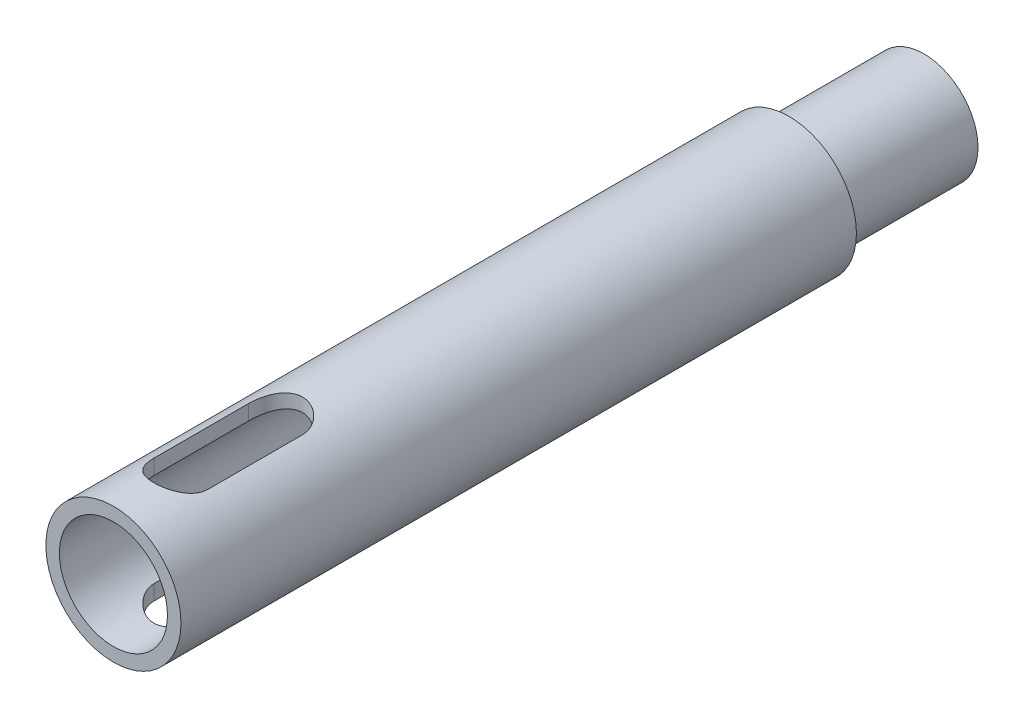
ISO-10303-21;
HEADER;
FILE_DESCRIPTION(('STEP AP214'),'2;1');
FILE_NAME('part.step','',(''),(''),'','','');
FILE_SCHEMA(('AUTOMOTIVE_DESIGN { 1 0 10303 214 1 1 1 1 }'));
ENDSEC;
DATA;
#1=APPLICATION_CONTEXT('core data for automotive mechanical design processes');
#2=APPLICATION_PROTOCOL_DEFINITION('international standard','automotive_design',2000,#1);
#3=PRODUCT_CONTEXT('',#1,'mechanical');
#4=PRODUCT('Part','Part','',(#3));
#5=PRODUCT_RELATED_PRODUCT_CATEGORY('part','',(#4));
#6=PRODUCT_DEFINITION_FORMATION('','',#4);
#7=PRODUCT_DEFINITION_CONTEXT('part definition',#1,'design');
#8=PRODUCT_DEFINITION('design','',#6,#7);
#9=PRODUCT_DEFINITION_SHAPE('','',#8);
#10=(LENGTH_UNIT() NAMED_UNIT(*) SI_UNIT(.MILLI.,.METRE.));
#11=(NAMED_UNIT(*) PLANE_ANGLE_UNIT() SI_UNIT($,.RADIAN.));
#12=(NAMED_UNIT(*) SI_UNIT($,.STERADIAN.) SOLID_ANGLE_UNIT());
#13=UNCERTAINTY_MEASURE_WITH_UNIT(LENGTH_MEASURE(1.E-05),#10,'distance_accuracy_value','');
#14=(GEOMETRIC_REPRESENTATION_CONTEXT(3) GLOBAL_UNCERTAINTY_ASSIGNED_CONTEXT((#13)) GLOBAL_UNIT_ASSIGNED_CONTEXT((#10,
#11,#12)) REPRESENTATION_CONTEXT('',''));
#15=CARTESIAN_POINT('',(0.,0.,0.));
#16=DIRECTION('',(0.,0.,1.));
#17=DIRECTION('',(1.,0.,0.));
#18=AXIS2_PLACEMENT_3D('',#15,#16,#17);
#19=CARTESIAN_POINT('',(0.,0.,60.));
#20=DIRECTION('',(0.,0.,-1.));
#21=DIRECTION('',(-1.,0.,0.));
#22=AXIS2_PLACEMENT_3D('',#19,#20,#21);
#23=CYLINDRICAL_SURFACE('',#22,5.);
#24=DIRECTION('',(0.,0.,-1.));
#25=VECTOR('',#24,1.);
#26=CARTESIAN_POINT('',(-2.,-4.58257569495584,60.));
#27=LINE('',#26,#25);
#28=CARTESIAN_POINT('',(-2.,-4.58257569495584,48.));
#29=VERTEX_POINT('',#28);
#30=CARTESIAN_POINT('',(-2.,-4.58257569495584,55.));
#31=VERTEX_POINT('',#30);
#32=EDGE_CURVE('E235',#29,#31,#27,.F.);
#33=ORIENTED_EDGE('',*,*,#32,.T.);
#34=CARTESIAN_POINT('',(-2.,-4.58257569495584,55.));
#35=CARTESIAN_POINT('',(-2.00000798036347,-4.58256464470381,55.0538058525026));
#36=CARTESIAN_POINT('',(-1.99782891366025,-4.58352306077323,55.1076056655576));
#37=CARTESIAN_POINT('',(-1.98915905973446,-4.58729625417543,55.2147712982547));
#38=CARTESIAN_POINT('',(-1.98266991468792,-4.59011032448545,55.268137275356));
#39=CARTESIAN_POINT('',(-1.9654760367637,-4.59749782920639,55.3738468215588));
#40=CARTESIAN_POINT('',(-1.95478796820434,-4.60206430717533,55.426193584044));
#41=CARTESIAN_POINT('',(-1.9293163019066,-4.61280053296682,55.5297007717145));
#42=CARTESIAN_POINT('',(-1.9145324541709,-4.61897037865398,55.5808611242772));
#43=CARTESIAN_POINT('',(-1.86426971793523,-4.63959291248421,55.731935850582));
#44=CARTESIAN_POINT('',(-1.82284489460008,-4.6561744915743,55.8296542306897));
#45=CARTESIAN_POINT('',(-1.72548191592177,-4.6931237076538,56.0167955800826));
#46=CARTESIAN_POINT('',(-1.66952996336926,-4.71349493864007,56.1062105529616));
#47=CARTESIAN_POINT('',(-1.54131835736855,-4.75700999402114,56.2792623966742));
#48=CARTESIAN_POINT('',(-1.4683691399273,-4.78024245635516,56.3623672169202));
#49=CARTESIAN_POINT('',(-1.30969646176209,-4.82612790548656,56.5155402722107));
#50=CARTESIAN_POINT('',(-1.22397038499682,-4.84878077249721,56.5856058308657));
#51=CARTESIAN_POINT('',(-1.03800590808969,-4.89203417106082,56.7134063941956));
#52=CARTESIAN_POINT('',(-0.937327933050969,-4.91251824543531,56.7705448092619));
#53=CARTESIAN_POINT('',(-0.726824143246717,-4.94803944125004,56.8668440726886));
#54=CARTESIAN_POINT('',(-0.617002169026251,-4.96307883544185,56.9060124240517));
#55=CARTESIAN_POINT('',(-0.396967441295696,-4.98538314653816,56.9633412013106));
#56=CARTESIAN_POINT('',(-0.287031054523065,-4.99298922547927,56.9824269509057));
#57=CARTESIAN_POINT('',(-0.0652684304565214,-5.00080310201086,57.0020284799456));
#58=CARTESIAN_POINT('',(0.0465571232841594,-5.0010135205303,57.0025508380235));
#59=CARTESIAN_POINT('',(0.262233376226779,-4.99421960045302,56.9855171608401));
#60=CARTESIAN_POINT('',(0.366179202506786,-4.98761985585461,56.968974953326));
#61=CARTESIAN_POINT('',(0.569674786500925,-4.96849270441446,56.9200065729465));
#62=CARTESIAN_POINT('',(0.669224295072838,-4.95596496209929,56.8875795011314));
#63=CARTESIAN_POINT('',(0.86289753907029,-4.92596830598785,56.8073637035755));
#64=CARTESIAN_POINT('',(0.956916851366435,-4.90842774755848,56.7593507591895));
#65=CARTESIAN_POINT('',(1.13580746919776,-4.87014602008043,56.6495354114049));
#66=CARTESIAN_POINT('',(1.22067554984697,-4.84940372896448,56.5877281703094));
#67=CARTESIAN_POINT('',(1.38476339273626,-4.80521782746144,56.4473558197415));
#68=CARTESIAN_POINT('',(1.46324770308939,-4.78168627172885,56.36795752533));
#69=CARTESIAN_POINT('',(1.60609926099477,-4.7356195058465,56.1970199048523));
#70=CARTESIAN_POINT('',(1.67046007709005,-4.71308475332783,56.1054750779057));
#71=CARTESIAN_POINT('',(1.78493657933605,-4.67095688856025,55.9095297159788));
#72=CARTESIAN_POINT('',(1.83458932217622,-4.65146702150583,55.8048351633398));
#73=CARTESIAN_POINT('',(1.91521298357264,-4.61886105059582,55.5876384755705));
#74=CARTESIAN_POINT('',(1.94621696002208,-4.60573367628738,55.4751505526617));
#75=CARTESIAN_POINT('',(1.9781058182572,-4.59208303529493,55.301256365842));
#76=CARTESIAN_POINT('',(1.98630505165979,-4.58853437680526,55.2413424506987));
#77=CARTESIAN_POINT('',(1.99725282103812,-4.58377540314389,55.1209649810045));
#78=CARTESIAN_POINT('',(2.00000471568568,-4.58256364711744,55.0605017882422));
#79=CARTESIAN_POINT('',(2.,-4.58257569495584,55.));
#80=B_SPLINE_CURVE_WITH_KNOTS('',3,(#34,#35,#36,#37,#38,#39,#40,#41,#42,#43,#44,#45,#46,#47,#48,
#49,#50,#51,#52,#53,#54,#55,#56,#57,#58,#59,#60,#61,#62,#63,#64,#65,#66,#67,#68,#69,#70,#71,#72,
#73,#74,#75,#76,#77,#78,#79),.UNSPECIFIED.,.F.,.F.,(4,2,2,2,2,2,2,2,2,2,2,2,2,2,2,2,2,2,2,2,2,2,
4),(0.,0.161354853098824,0.322648263883208,0.483307911251883,0.643977367092303,
0.964683001739086,1.28569434942625,1.62318047995498,1.9607358053919,2.31162858925763,
2.66237473197322,2.99613876504269,3.32978451514655,3.64468915259534,3.95961161305654,
4.27928176927546,4.59906421133018,4.93981874675152,5.28072813203933,5.63144241548461,
5.98153315592124,6.16300192557813,6.34435877193561),.UNSPECIFIED.);
#81=CARTESIAN_POINT('',(2.,-4.58257569495584,55.));
#82=VERTEX_POINT('',#81);
#83=EDGE_CURVE('E129',#31,#82,#80,.T.);
#84=ORIENTED_EDGE('',*,*,#83,.T.);
#85=DIRECTION('',(0.,0.,-1.));
#86=VECTOR('',#85,1.);
#87=CARTESIAN_POINT('',(2.,-4.58257569495584,60.));
#88=LINE('',#87,#86);
#89=CARTESIAN_POINT('',(2.,-4.58257569495584,48.));
#90=VERTEX_POINT('',#89);
#91=EDGE_CURVE('E188',#82,#90,#88,.T.);
#92=ORIENTED_EDGE('',*,*,#91,.T.);
#93=CARTESIAN_POINT('',(2.,-4.58257569495584,48.));
#94=CARTESIAN_POINT('',(2.00000798036348,-4.58256464470381,47.9461941474974));
#95=CARTESIAN_POINT('',(1.99782891366025,-4.58352306077323,47.8923943344423));
#96=CARTESIAN_POINT('',(1.98915905973447,-4.58729625417543,47.7852287017453));
#97=CARTESIAN_POINT('',(1.98266991468793,-4.59011032448545,47.731862724644));
#98=CARTESIAN_POINT('',(1.9654760367637,-4.59749782920639,47.6261531784412));
#99=CARTESIAN_POINT('',(1.95478796820434,-4.60206430717533,47.573806415956));
#100=CARTESIAN_POINT('',(1.92931630190661,-4.61280053296682,47.4702992282855));
#101=CARTESIAN_POINT('',(1.91453245417091,-4.61897037865398,47.4191388757228));
#102=CARTESIAN_POINT('',(1.86426971793523,-4.63959291248421,47.268064149418));
#103=CARTESIAN_POINT('',(1.82284489460008,-4.6561744915743,47.1703457693103));
#104=CARTESIAN_POINT('',(1.72548191592176,-4.6931237076538,46.9832044199174));
#105=CARTESIAN_POINT('',(1.66952996336926,-4.71349493864007,46.8937894470383));
#106=CARTESIAN_POINT('',(1.54131835736855,-4.75700999402114,46.7207376033258));
#107=CARTESIAN_POINT('',(1.4683691399273,-4.78024245635516,46.6376327830798));
#108=CARTESIAN_POINT('',(1.30969646176209,-4.82612790548656,46.4844597277893));
#109=CARTESIAN_POINT('',(1.22397038499682,-4.84878077249721,46.4143941691343));
#110=CARTESIAN_POINT('',(1.03800590808969,-4.89203417106082,46.2865936058043));
#111=CARTESIAN_POINT('',(0.937327933050962,-4.91251824543531,46.2294551907381));
#112=CARTESIAN_POINT('',(0.726824143246709,-4.94803944125004,46.1331559273114));
#113=CARTESIAN_POINT('',(0.617002169026242,-4.96307883544185,46.0939875759483));
#114=CARTESIAN_POINT('',(0.396967441295688,-4.98538314653816,46.0366587986894));
#115=CARTESIAN_POINT('',(0.287031054523057,-4.99298922547927,46.0175730490943));
#116=CARTESIAN_POINT('',(0.065268430456513,-5.00080310201086,45.9979715200544));
#117=CARTESIAN_POINT('',(-0.0465571232841676,-5.0010135205303,45.9974491619765));
#118=CARTESIAN_POINT('',(-0.262233376226786,-4.99421960045302,46.0144828391599));
#119=CARTESIAN_POINT('',(-0.366179202506794,-4.98761985585461,46.031025046674));
#120=CARTESIAN_POINT('',(-0.569674786500933,-4.96849270441446,46.0799934270535));
#121=CARTESIAN_POINT('',(-0.669224295072845,-4.95596496209929,46.1124204988686));
#122=CARTESIAN_POINT('',(-0.862897539070298,-4.92596830598785,46.1926362964245));
#123=CARTESIAN_POINT('',(-0.956916851366443,-4.90842774755848,46.2406492408105));
#124=CARTESIAN_POINT('',(-1.13580746919777,-4.87014602008043,46.3504645885952));
#125=CARTESIAN_POINT('',(-1.22067554984698,-4.84940372896448,46.4122718296906));
#126=CARTESIAN_POINT('',(-1.38476339273627,-4.80521782746144,46.5526441802585));
#127=CARTESIAN_POINT('',(-1.4632477030894,-4.78168627172884,46.63204247467));
#128=CARTESIAN_POINT('',(-1.60609926099478,-4.7356195058465,46.8029800951477));
#129=CARTESIAN_POINT('',(-1.67046007709006,-4.71308475332783,46.8945249220943));
#130=CARTESIAN_POINT('',(-1.78493657933605,-4.67095688856024,47.0904702840212));
#131=CARTESIAN_POINT('',(-1.83458932217622,-4.65146702150583,47.1951648366602));
#132=CARTESIAN_POINT('',(-1.91521298357264,-4.61886105059581,47.4123615244295));
#133=CARTESIAN_POINT('',(-1.94621696002208,-4.60573367628738,47.5248494473383));
#134=CARTESIAN_POINT('',(-1.9781058182572,-4.59208303529493,47.698743634158));
#135=CARTESIAN_POINT('',(-1.98630505165979,-4.58853437680526,47.7586575493013));
#136=CARTESIAN_POINT('',(-1.99725282103812,-4.58377540314388,47.8790350189956));
#137=CARTESIAN_POINT('',(-2.00000471568568,-4.58256364711744,47.9394982117578));
#138=CARTESIAN_POINT('',(-2.,-4.58257569495584,48.));
#139=B_SPLINE_CURVE_WITH_KNOTS('',3,(#93,#94,#95,#96,#97,#98,#99,#100,#101,#102,#103,#104,#105,
#106,#107,#108,#109,#110,#111,#112,#113,#114,#115,#116,#117,#118,#119,#120,#121,#122,#123,#124,
#125,#126,#127,#128,#129,#130,#131,#132,#133,#134,#135,#136,#137,#138),.UNSPECIFIED.,.F.,.F.,(4,
2,2,2,2,2,2,2,2,2,2,2,2,2,2,2,2,2,2,2,2,2,4),(0.,0.161354853098831,0.322648263883215,
0.48330791125189,0.64397736709231,0.964683001739094,1.28569434942625,1.62318047995498,
1.96073580539191,2.31162858925764,2.66237473197323,2.9961387650427,3.32978451514656,
3.64468915259536,3.95961161305655,4.27928176927548,4.59906421133019,4.93981874675155,
5.28072813203934,5.63144241548463,5.98153315592125,6.16300192557814,6.34435877193562),.UNSPECIFIED.);
#140=EDGE_CURVE('E191',#90,#29,#139,.T.);
#141=ORIENTED_EDGE('',*,*,#140,.T.);
#142=EDGE_LOOP('',(#33,#84,#92,#141));
#143=FACE_BOUND('',#142,.T.);
#144=DIRECTION('',(0.,0.,-1.));
#145=VECTOR('',#144,1.);
#146=CARTESIAN_POINT('',(2.,4.58257569495584,60.));
#147=LINE('',#146,#145);
#148=CARTESIAN_POINT('',(2.,4.58257569495584,48.));
#149=VERTEX_POINT('',#148);
#150=CARTESIAN_POINT('',(2.,4.58257569495584,55.));
#151=VERTEX_POINT('',#150);
#152=EDGE_CURVE('E185',#149,#151,#147,.F.);
#153=ORIENTED_EDGE('',*,*,#152,.T.);
#154=CARTESIAN_POINT('',(2.,4.58257569495584,55.));
#155=CARTESIAN_POINT('',(2.00000798036347,4.58256464470381,55.0538058525026));
#156=CARTESIAN_POINT('',(1.99782891366025,4.58352306077323,55.1076056655576));
#157=CARTESIAN_POINT('',(1.98915905973446,4.58729625417543,55.2147712982547));
#158=CARTESIAN_POINT('',(1.98266991468792,4.59011032448545,55.268137275356));
#159=CARTESIAN_POINT('',(1.9654760367637,4.59749782920639,55.3738468215588));
#160=CARTESIAN_POINT('',(1.95478796820434,4.60206430717533,55.426193584044));
#161=CARTESIAN_POINT('',(1.9293163019066,4.61280053296682,55.5297007717145));
#162=CARTESIAN_POINT('',(1.9145324541709,4.61897037865398,55.5808611242772));
#163=CARTESIAN_POINT('',(1.86426971793523,4.63959291248421,55.731935850582));
#164=CARTESIAN_POINT('',(1.82284489460008,4.6561744915743,55.8296542306897));
#165=CARTESIAN_POINT('',(1.72548191592177,4.6931237076538,56.0167955800826));
#166=CARTESIAN_POINT('',(1.66952996336926,4.71349493864007,56.1062105529616));
#167=CARTESIAN_POINT('',(1.54131835736855,4.75700999402114,56.2792623966742));
#168=CARTESIAN_POINT('',(1.4683691399273,4.78024245635516,56.3623672169202));
#169=CARTESIAN_POINT('',(1.30969646176209,4.82612790548656,56.5155402722107));
#170=CARTESIAN_POINT('',(1.22397038499682,4.84878077249721,56.5856058308657));
#171=CARTESIAN_POINT('',(1.03800590808969,4.89203417106082,56.7134063941956));
#172=CARTESIAN_POINT('',(0.937327933050969,4.91251824543531,56.7705448092619));
#173=CARTESIAN_POINT('',(0.726824143246717,4.94803944125004,56.8668440726886));
#174=CARTESIAN_POINT('',(0.617002169026251,4.96307883544185,56.9060124240517));
#175=CARTESIAN_POINT('',(0.396967441295696,4.98538314653816,56.9633412013106));
#176=CARTESIAN_POINT('',(0.287031054523065,4.99298922547927,56.9824269509057));
#177=CARTESIAN_POINT('',(0.0652684304565214,5.00080310201086,57.0020284799456));
#178=CARTESIAN_POINT('',(-0.0465571232841594,5.0010135205303,57.0025508380235));
#179=CARTESIAN_POINT('',(-0.262233376226779,4.99421960045302,56.9855171608401));
#180=CARTESIAN_POINT('',(-0.366179202506786,4.98761985585461,56.968974953326));
#181=CARTESIAN_POINT('',(-0.569674786500925,4.96849270441446,56.9200065729465));
#182=CARTESIAN_POINT('',(-0.669224295072838,4.95596496209929,56.8875795011314));
#183=CARTESIAN_POINT('',(-0.86289753907029,4.92596830598785,56.8073637035755));
#184=CARTESIAN_POINT('',(-0.956916851366435,4.90842774755848,56.7593507591895));
#185=CARTESIAN_POINT('',(-1.13580746919776,4.87014602008043,56.6495354114049));
#186=CARTESIAN_POINT('',(-1.22067554984697,4.84940372896448,56.5877281703094));
#187=CARTESIAN_POINT('',(-1.38476339273626,4.80521782746144,56.4473558197415));
#188=CARTESIAN_POINT('',(-1.46324770308939,4.78168627172885,56.36795752533));
#189=CARTESIAN_POINT('',(-1.60609926099477,4.7356195058465,56.1970199048523));
#190=CARTESIAN_POINT('',(-1.67046007709005,4.71308475332783,56.1054750779057));
#191=CARTESIAN_POINT('',(-1.78493657933605,4.67095688856025,55.9095297159788));
#192=CARTESIAN_POINT('',(-1.83458932217622,4.65146702150583,55.8048351633398));
#193=CARTESIAN_POINT('',(-1.91521298357264,4.61886105059582,55.5876384755705));
#194=CARTESIAN_POINT('',(-1.94621696002208,4.60573367628738,55.4751505526617));
#195=CARTESIAN_POINT('',(-1.9781058182572,4.59208303529493,55.301256365842));
#196=CARTESIAN_POINT('',(-1.98630505165979,4.58853437680526,55.2413424506987));
#197=CARTESIAN_POINT('',(-1.99725282103812,4.58377540314389,55.1209649810045));
#198=CARTESIAN_POINT('',(-2.00000471568568,4.58256364711744,55.0605017882422));
#199=CARTESIAN_POINT('',(-2.,4.58257569495584,55.));
#200=B_SPLINE_CURVE_WITH_KNOTS('',3,(#154,#155,#156,#157,#158,#159,#160,#161,#162,#163,#164,
#165,#166,#167,#168,#169,#170,#171,#172,#173,#174,#175,#176,#177,#178,#179,#180,#181,#182,#183,
#184,#185,#186,#187,#188,#189,#190,#191,#192,#193,#194,#195,#196,#197,#198,#199),.UNSPECIFIED.,
.F.,.F.,(4,2,2,2,2,2,2,2,2,2,2,2,2,2,2,2,2,2,2,2,2,2,4),(0.,0.161354853098824,0.322648263883208,
0.483307911251883,0.643977367092303,0.964683001739086,1.28569434942625,1.62318047995498,
1.9607358053919,2.31162858925763,2.66237473197322,2.99613876504269,3.32978451514655,
3.64468915259534,3.95961161305654,4.27928176927546,4.59906421133018,4.93981874675152,
5.28072813203933,5.63144241548461,5.98153315592124,6.16300192557813,6.34435877193561),.UNSPECIFIED.);
#201=CARTESIAN_POINT('',(-2.,4.58257569495584,55.));
#202=VERTEX_POINT('',#201);
#203=EDGE_CURVE('E177',#151,#202,#200,.T.);
#204=ORIENTED_EDGE('',*,*,#203,.T.);
#205=DIRECTION('',(0.,0.,-1.));
#206=VECTOR('',#205,1.);
#207=CARTESIAN_POINT('',(-2.,4.58257569495584,60.));
#208=LINE('',#207,#206);
#209=CARTESIAN_POINT('',(-2.,4.58257569495584,48.));
#210=VERTEX_POINT('',#209);
#211=EDGE_CURVE('E178',#202,#210,#208,.T.);
#212=ORIENTED_EDGE('',*,*,#211,.T.);
#213=CARTESIAN_POINT('',(-2.,4.58257569495584,48.));
#214=CARTESIAN_POINT('',(-2.00000798036348,4.58256464470381,47.9461941474974));
#215=CARTESIAN_POINT('',(-1.99782891366025,4.58352306077323,47.8923943344423));
#216=CARTESIAN_POINT('',(-1.98915905973446,4.58729625417543,47.7852287017453));
#217=CARTESIAN_POINT('',(-1.98266991468792,4.59011032448545,47.731862724644));
#218=CARTESIAN_POINT('',(-1.9654760367637,4.5974978292064,47.6261531784412));
#219=CARTESIAN_POINT('',(-1.95478796820434,4.60206430717533,47.573806415956));
#220=CARTESIAN_POINT('',(-1.9293163019066,4.61280053296682,47.4702992282855));
#221=CARTESIAN_POINT('',(-1.9145324541709,4.61897037865398,47.4191388757228));
#222=CARTESIAN_POINT('',(-1.86426971793522,4.63959291248421,47.268064149418));
#223=CARTESIAN_POINT('',(-1.82284489460008,4.6561744915743,47.1703457693103));
#224=CARTESIAN_POINT('',(-1.72548191592176,4.6931237076538,46.9832044199174));
#225=CARTESIAN_POINT('',(-1.66952996336926,4.71349493864007,46.8937894470383));
#226=CARTESIAN_POINT('',(-1.54131835736855,4.75700999402114,46.7207376033258));
#227=CARTESIAN_POINT('',(-1.4683691399273,4.78024245635516,46.6376327830798));
#228=CARTESIAN_POINT('',(-1.30969646176209,4.82612790548656,46.4844597277893));
#229=CARTESIAN_POINT('',(-1.22397038499682,4.84878077249721,46.4143941691343));
#230=CARTESIAN_POINT('',(-1.03800590808968,4.89203417106082,46.2865936058043));
#231=CARTESIAN_POINT('',(-0.93732793305096,4.91251824543531,46.2294551907381));
#232=CARTESIAN_POINT('',(-0.726824143246708,4.94803944125004,46.1331559273114));
#233=CARTESIAN_POINT('',(-0.617002169026241,4.96307883544185,46.0939875759483));
#234=CARTESIAN_POINT('',(-0.396967441295686,4.98538314653816,46.0366587986894));
#235=CARTESIAN_POINT('',(-0.287031054523055,4.99298922547927,46.0175730490943));
#236=CARTESIAN_POINT('',(-0.0652684304565112,5.00080310201085,45.9979715200544));
#237=CARTESIAN_POINT('',(0.0465571232841692,5.0010135205303,45.9974491619765));
#238=CARTESIAN_POINT('',(0.262233376226788,4.99421960045302,46.0144828391599));
#239=CARTESIAN_POINT('',(0.366179202506796,4.98761985585461,46.031025046674));
#240=CARTESIAN_POINT('',(0.569674786500935,4.96849270441446,46.0799934270535));
#241=CARTESIAN_POINT('',(0.669224295072847,4.95596496209929,46.1124204988686));
#242=CARTESIAN_POINT('',(0.8628975390703,4.92596830598785,46.1926362964245));
#243=CARTESIAN_POINT('',(0.956916851366445,4.90842774755848,46.2406492408105));
#244=CARTESIAN_POINT('',(1.13580746919777,4.87014602008043,46.3504645885952));
#245=CARTESIAN_POINT('',(1.22067554984698,4.84940372896448,46.4122718296906));
#246=CARTESIAN_POINT('',(1.38476339273627,4.80521782746143,46.5526441802585));
#247=CARTESIAN_POINT('',(1.4632477030894,4.78168627172884,46.63204247467));
#248=CARTESIAN_POINT('',(1.60609926099478,4.7356195058465,46.8029800951477));
#249=CARTESIAN_POINT('',(1.67046007709006,4.71308475332783,46.8945249220943));
#250=CARTESIAN_POINT('',(1.78493657933606,4.67095688856024,47.0904702840212));
#251=CARTESIAN_POINT('',(1.83458932217622,4.65146702150583,47.1951648366602));
#252=CARTESIAN_POINT('',(1.91521298357264,4.61886105059581,47.4123615244295));
#253=CARTESIAN_POINT('',(1.94621696002208,4.60573367628738,47.5248494473383));
#254=CARTESIAN_POINT('',(1.9781058182572,4.59208303529493,47.698743634158));
#255=CARTESIAN_POINT('',(1.98630505165979,4.58853437680526,47.7586575493013));
#256=CARTESIAN_POINT('',(1.99725282103812,4.58377540314388,47.8790350189956));
#257=CARTESIAN_POINT('',(2.00000471568568,4.58256364711744,47.9394982117578));
#258=CARTESIAN_POINT('',(2.,4.58257569495584,48.));
#259=B_SPLINE_CURVE_WITH_KNOTS('',3,(#213,#214,#215,#216,#217,#218,#219,#220,#221,#222,#223,
#224,#225,#226,#227,#228,#229,#230,#231,#232,#233,#234,#235,#236,#237,#238,#239,#240,#241,#242,
#243,#244,#245,#246,#247,#248,#249,#250,#251,#252,#253,#254,#255,#256,#257,#258),.UNSPECIFIED.,
.F.,.F.,(4,2,2,2,2,2,2,2,2,2,2,2,2,2,2,2,2,2,2,2,2,2,4),(0.,0.161354853098831,0.322648263883215,
0.48330791125189,0.64397736709231,0.964683001739094,1.28569434942625,1.62318047995498,
1.96073580539191,2.31162858925764,2.66237473197323,2.9961387650427,3.32978451514656,
3.64468915259536,3.95961161305655,4.27928176927548,4.5990642113302,4.93981874675154,
5.28072813203934,5.63144241548463,5.98153315592126,6.16300192557815,6.34435877193562),.UNSPECIFIED.);
#260=EDGE_CURVE('E197',#210,#149,#259,.T.);
#261=ORIENTED_EDGE('',*,*,#260,.T.);
#262=EDGE_LOOP('',(#153,#204,#212,#261));
#263=FACE_BOUND('',#262,.T.);
#264=CARTESIAN_POINT('',(0.,0.,10.));
#265=DIRECTION('',(0.,0.,1.));
#266=DIRECTION('',(1.,0.,0.));
#267=AXIS2_PLACEMENT_3D('',#264,#265,#266);
#268=CIRCLE('',#267,5.);
#269=CARTESIAN_POINT('',(5.,0.,10.));
#270=VERTEX_POINT('',#269);
#271=EDGE_CURVE('E281',#270,#270,#268,.T.);
#272=ORIENTED_EDGE('',*,*,#271,.T.);
#273=EDGE_LOOP('',(#272));
#274=FACE_BOUND('',#273,.T.);
#275=CARTESIAN_POINT('',(0.,0.,60.));
#276=DIRECTION('',(0.,0.,1.));
#277=DIRECTION('',(1.,0.,0.));
#278=AXIS2_PLACEMENT_3D('',#275,#276,#277);
#279=CIRCLE('',#278,5.);
#280=CARTESIAN_POINT('',(5.,0.,60.));
#281=VERTEX_POINT('',#280);
#282=EDGE_CURVE('E123',#281,#281,#279,.T.);
#283=ORIENTED_EDGE('',*,*,#282,.F.);
#284=EDGE_LOOP('',(#283));
#285=FACE_BOUND('',#284,.T.);
#286=ADVANCED_FACE('F44',(#143,#263,#274,#285),#23,.T.);
#287=CARTESIAN_POINT('',(0.,0.,60.));
#288=DIRECTION('',(0.,0.,1.));
#289=DIRECTION('',(1.,0.,0.));
#290=AXIS2_PLACEMENT_3D('',#287,#288,#289);
#291=PLANE('',#290);
#292=CARTESIAN_POINT('',(0.,0.,60.));
#293=DIRECTION('',(0.,0.,1.));
#294=DIRECTION('',(1.,0.,0.));
#295=AXIS2_PLACEMENT_3D('',#292,#293,#294);
#296=CIRCLE('',#295,4.);
#297=CARTESIAN_POINT('',(4.,0.,60.));
#298=VERTEX_POINT('',#297);
#299=EDGE_CURVE('E278',#298,#298,#296,.T.);
#300=ORIENTED_EDGE('',*,*,#299,.F.);
#301=EDGE_LOOP('',(#300));
#302=FACE_BOUND('',#301,.T.);
#303=ORIENTED_EDGE('',*,*,#282,.T.);
#304=EDGE_LOOP('',(#303));
#305=FACE_BOUND('',#304,.T.);
#306=ADVANCED_FACE('F250',(#302,#305),#291,.T.);
#307=CARTESIAN_POINT('',(0.,0.,10.));
#308=DIRECTION('',(0.,0.,1.));
#309=DIRECTION('',(1.,0.,0.));
#310=AXIS2_PLACEMENT_3D('',#307,#308,#309);
#311=PLANE('',#310);
#312=ORIENTED_EDGE('',*,*,#271,.F.);
#313=EDGE_LOOP('',(#312));
#314=FACE_BOUND('',#313,.T.);
#315=CARTESIAN_POINT('',(0.,0.,10.));
#316=DIRECTION('',(0.,0.,1.));
#317=DIRECTION('',(1.,0.,0.));
#318=AXIS2_PLACEMENT_3D('',#315,#316,#317);
#319=CIRCLE('',#318,4.);
#320=CARTESIAN_POINT('',(4.,0.,10.));
#321=VERTEX_POINT('',#320);
#322=EDGE_CURVE('E277',#321,#321,#319,.T.);
#323=ORIENTED_EDGE('',*,*,#322,.T.);
#324=EDGE_LOOP('',(#323));
#325=FACE_BOUND('',#324,.T.);
#326=ADVANCED_FACE('F254',(#314,#325),#311,.F.);
#327=CARTESIAN_POINT('',(0.,0.,10.));
#328=DIRECTION('',(0.,0.,-1.));
#329=DIRECTION('',(-1.,0.,0.));
#330=AXIS2_PLACEMENT_3D('',#327,#328,#329);
#331=CYLINDRICAL_SURFACE('',#330,4.);
#332=ORIENTED_EDGE('',*,*,#322,.F.);
#333=EDGE_LOOP('',(#332));
#334=FACE_BOUND('',#333,.T.);
#335=CARTESIAN_POINT('',(0.,0.,0.));
#336=DIRECTION('',(0.,0.,1.));
#337=DIRECTION('',(1.,0.,0.));
#338=AXIS2_PLACEMENT_3D('',#335,#336,#337);
#339=CIRCLE('',#338,4.);
#340=CARTESIAN_POINT('',(4.,0.,0.));
#341=VERTEX_POINT('',#340);
#342=EDGE_CURVE('E275',#341,#341,#339,.T.);
#343=ORIENTED_EDGE('',*,*,#342,.T.);
#344=EDGE_LOOP('',(#343));
#345=FACE_BOUND('',#344,.T.);
#346=ADVANCED_FACE('F260',(#334,#345),#331,.T.);
#347=CARTESIAN_POINT('',(0.,0.,0.));
#348=DIRECTION('',(0.,0.,1.));
#349=DIRECTION('',(1.,0.,0.));
#350=AXIS2_PLACEMENT_3D('',#347,#348,#349);
#351=PLANE('',#350);
#352=ORIENTED_EDGE('',*,*,#342,.F.);
#353=EDGE_LOOP('',(#352));
#354=FACE_BOUND('',#353,.T.);
#355=ADVANCED_FACE('F265',(#354),#351,.F.);
#356=CARTESIAN_POINT('',(0.,0.,60.));
#357=DIRECTION('',(0.,0.,-1.));
#358=DIRECTION('',(-1.,0.,0.));
#359=AXIS2_PLACEMENT_3D('',#356,#357,#358);
#360=CYLINDRICAL_SURFACE('',#359,4.);
#361=CARTESIAN_POINT('',(-2.,3.46410161513775,48.));
#362=CARTESIAN_POINT('',(-2.00000943869001,3.46408620970987,47.9476220519747));
#363=CARTESIAN_POINT('',(-1.99794273869157,3.46528916979241,47.8952526641788));
#364=CARTESIAN_POINT('',(-1.98973134530659,3.47001582547733,47.7909712801243));
#365=CARTESIAN_POINT('',(-1.98358915744987,3.47353809520359,47.7390590226874));
#366=CARTESIAN_POINT('',(-1.96734758392331,3.48276113120576,47.6363619738046));
#367=CARTESIAN_POINT('',(-1.95727108055602,3.48844929580341,47.5855724256294));
#368=CARTESIAN_POINT('',(-1.93329379612757,3.50179425827599,47.4851779087298));
#369=CARTESIAN_POINT('',(-1.91939257579648,3.5094512822684,47.4355730767821));
#370=CARTESIAN_POINT('',(-1.87223751000493,3.53496971479961,47.2892287747288));
#371=CARTESIAN_POINT('',(-1.83348206518134,3.55540886386695,47.194648858175));
#372=CARTESIAN_POINT('',(-1.74260973580062,3.60081691495323,47.0132664512997));
#373=CARTESIAN_POINT('',(-1.69047214803722,3.62579281802088,46.9264762956911));
#374=CARTESIAN_POINT('',(-1.56932700935895,3.67994024124641,46.7553830860898));
#375=CARTESIAN_POINT('',(-1.49928845749503,3.70928784184413,46.6718640168844));
#376=CARTESIAN_POINT('',(-1.34648855278875,3.76744628526356,46.5171658282364));
#377=CARTESIAN_POINT('',(-1.2637237596621,3.79625698057539,46.4459900566607));
#378=CARTESIAN_POINT('',(-1.08097958990492,3.852429394718,46.3132663420924));
#379=CARTESIAN_POINT('',(-0.980215181611713,3.87956191127973,46.2526930320098));
#380=CARTESIAN_POINT('',(-0.76831488069117,3.92701497394428,46.1497185187135));
#381=CARTESIAN_POINT('',(-0.657185507148496,3.94733976534538,46.107305985825));
#382=CARTESIAN_POINT('',(-0.436090764194856,3.97760910429472,46.0449909460731));
#383=CARTESIAN_POINT('',(-0.326605376453688,3.98818943198116,46.0237013005992));
#384=CARTESIAN_POINT('',(-0.105143090997524,4.00015165315059,45.9996678034435));
#385=CARTESIAN_POINT('',(0.00683230076447122,4.0015389624913,45.9969130323472));
#386=CARTESIAN_POINT('',(0.219666020360654,3.99525960973526,46.0094934055646));
#387=CARTESIAN_POINT('',(0.32064432992476,3.98836978544159,46.0232762918444));
#388=CARTESIAN_POINT('',(0.518629401924055,3.96748463780782,46.0657622402523));
#389=CARTESIAN_POINT('',(0.615635942593484,3.9534889182895,46.0944661342803));
#390=CARTESIAN_POINT('',(0.80461807413788,3.91943179430851,46.1661648482658));
#391=CARTESIAN_POINT('',(0.89650547395944,3.89928913517567,46.2093519242299));
#392=CARTESIAN_POINT('',(1.0719523739539,3.85475327589208,46.3085260635035));
#393=CARTESIAN_POINT('',(1.15550875300778,3.83035849206883,46.3645178982838));
#394=CARTESIAN_POINT('',(1.32034170525748,3.77688971838165,46.4937860807414));
#395=CARTESIAN_POINT('',(1.40065758878075,3.74759139866565,46.5681954481847));
#396=CARTESIAN_POINT('',(1.54820014968351,3.6890905267488,46.72916916122));
#397=CARTESIAN_POINT('',(1.61541504384545,3.65988808377385,46.8157443295867));
#398=CARTESIAN_POINT('',(1.73905371288664,3.60286331192321,47.0053594541426));
#399=CARTESIAN_POINT('',(1.79450839108784,3.57524975585781,47.1090994171856));
#400=CARTESIAN_POINT('',(1.88669118631508,3.52747996877226,47.326045974776));
#401=CARTESIAN_POINT('',(1.92346416437439,3.50730590530613,47.4392291240742));
#402=CARTESIAN_POINT('',(1.96647223368325,3.48329612458051,47.6278218305616));
#403=CARTESIAN_POINT('',(1.97899117486891,3.47616914725418,47.7014259523032));
#404=CARTESIAN_POINT('',(1.99577612591724,3.46654103519923,47.8499929359233));
#405=CARTESIAN_POINT('',(2.0000275670162,3.4640480667353,47.9249579618279));
#406=CARTESIAN_POINT('',(2.,3.46410161513775,48.));
#407=B_SPLINE_CURVE_WITH_KNOTS('',3,(#361,#362,#363,#364,#365,#366,#367,#368,#369,#370,#371,
#372,#373,#374,#375,#376,#377,#378,#379,#380,#381,#382,#383,#384,#385,#386,#387,#388,#389,#390,
#391,#392,#393,#394,#395,#396,#397,#398,#399,#400,#401,#402,#403,#404,#405,#406),.UNSPECIFIED.,
.F.,.F.,(4,2,2,2,2,2,2,2,2,2,2,2,2,2,2,2,2,2,2,2,2,2,4),(0.,0.157065244429686,0.314034017590654,
0.470103130002192,0.626190174486595,0.937427814388441,1.24914989609589,1.58636722175674,
1.92367586815313,2.2837609112087,2.643620985295,2.97787141914153,3.31192491942518,
3.61692930404831,3.92195069558821,4.23119285312315,4.54055043268371,4.87912635702851,
5.21800541026929,5.57862778091816,5.93838003367367,6.16281283132481,6.38764076124),.UNSPECIFIED.);
#408=CARTESIAN_POINT('',(-2.,3.46410161513776,48.));
#409=VERTEX_POINT('',#408);
#410=CARTESIAN_POINT('',(2.,3.46410161513775,48.));
#411=VERTEX_POINT('',#410);
#412=EDGE_CURVE('E13',#409,#411,#407,.T.);
#413=ORIENTED_EDGE('',*,*,#412,.F.);
#414=DIRECTION('',(0.,0.,-1.));
#415=VECTOR('',#414,1.);
#416=CARTESIAN_POINT('',(-2.,3.46410161513776,60.));
#417=LINE('',#416,#415);
#418=CARTESIAN_POINT('',(-2.,3.46410161513776,55.));
#419=VERTEX_POINT('',#418);
#420=EDGE_CURVE('E216',#419,#409,#417,.T.);
#421=ORIENTED_EDGE('',*,*,#420,.F.);
#422=CARTESIAN_POINT('',(2.,3.46410161513776,55.));
#423=CARTESIAN_POINT('',(2.00000943869001,3.46408620970987,55.0523779480253));
#424=CARTESIAN_POINT('',(1.99794273869157,3.46528916979241,55.1047473358213));
#425=CARTESIAN_POINT('',(1.98973134530659,3.47001582547733,55.2090287198757));
#426=CARTESIAN_POINT('',(1.98358915744987,3.47353809520359,55.2609409773126));
#427=CARTESIAN_POINT('',(1.96734758392331,3.48276113120576,55.3636380261954));
#428=CARTESIAN_POINT('',(1.95727108055602,3.48844929580341,55.4144275743706));
#429=CARTESIAN_POINT('',(1.93329379612757,3.50179425827599,55.5148220912702));
#430=CARTESIAN_POINT('',(1.91939257579648,3.5094512822684,55.5644269232179));
#431=CARTESIAN_POINT('',(1.87223751000493,3.53496971479961,55.7107712252712));
#432=CARTESIAN_POINT('',(1.83348206518134,3.55540886386695,55.805351141825));
#433=CARTESIAN_POINT('',(1.74260973580062,3.60081691495323,55.9867335487003));
#434=CARTESIAN_POINT('',(1.69047214803722,3.62579281802088,56.0735237043089));
#435=CARTESIAN_POINT('',(1.56932700935895,3.67994024124641,56.2446169139102));
#436=CARTESIAN_POINT('',(1.49928845749502,3.70928784184414,56.3281359831156));
#437=CARTESIAN_POINT('',(1.34648855278874,3.76744628526357,56.4828341717636));
#438=CARTESIAN_POINT('',(1.2637237596621,3.79625698057539,56.5540099433393));
#439=CARTESIAN_POINT('',(1.08097958990492,3.852429394718,56.6867336579076));
#440=CARTESIAN_POINT('',(0.980215181611717,3.87956191127973,56.7473069679902));
#441=CARTESIAN_POINT('',(0.768314880691174,3.92701497394428,56.8502814812865));
#442=CARTESIAN_POINT('',(0.657185507148496,3.94733976534538,56.892694014175));
#443=CARTESIAN_POINT('',(0.436090764194852,3.97760910429472,56.9550090539269));
#444=CARTESIAN_POINT('',(0.326605376453686,3.98818943198116,56.9762986994008));
#445=CARTESIAN_POINT('',(0.105143090997524,4.00015165315059,57.0003321965565));
#446=CARTESIAN_POINT('',(-0.00683230076447161,4.0015389624913,57.0030869676528));
#447=CARTESIAN_POINT('',(-0.219666020360655,3.99525960973526,56.9905065944354));
#448=CARTESIAN_POINT('',(-0.320644329924761,3.98836978544159,56.9767237081556));
#449=CARTESIAN_POINT('',(-0.518629401924054,3.96748463780782,56.9342377597476));
#450=CARTESIAN_POINT('',(-0.615635942593483,3.9534889182895,56.9055338657197));
#451=CARTESIAN_POINT('',(-0.804618074137878,3.91943179430851,56.8338351517342));
#452=CARTESIAN_POINT('',(-0.896505473959439,3.89928913517567,56.7906480757701));
#453=CARTESIAN_POINT('',(-1.0719523739539,3.85475327589208,56.6914739364965));
#454=CARTESIAN_POINT('',(-1.15550875300778,3.83035849206883,56.6354821017162));
#455=CARTESIAN_POINT('',(-1.32034170525747,3.77688971838165,56.5062139192586));
#456=CARTESIAN_POINT('',(-1.40065758878075,3.74759139866565,56.4318045518153));
#457=CARTESIAN_POINT('',(-1.54820014968351,3.6890905267488,56.27083083878));
#458=CARTESIAN_POINT('',(-1.61541504384544,3.65988808377385,56.1842556704133));
#459=CARTESIAN_POINT('',(-1.73905371288663,3.60286331192321,55.9946405458574));
#460=CARTESIAN_POINT('',(-1.79450839108784,3.57524975585781,55.8909005828144));
#461=CARTESIAN_POINT('',(-1.88669118631508,3.52747996877227,55.673954025224));
#462=CARTESIAN_POINT('',(-1.92346416437439,3.50730590530614,55.5607708759258));
#463=CARTESIAN_POINT('',(-1.96647223368324,3.48329612458051,55.3721781694384));
#464=CARTESIAN_POINT('',(-1.97899117486891,3.47616914725418,55.2985740476968));
#465=CARTESIAN_POINT('',(-1.99577612591724,3.46654103519923,55.1500070640767));
#466=CARTESIAN_POINT('',(-2.00002756701619,3.4640480667353,55.0750420381721));
#467=CARTESIAN_POINT('',(-2.,3.46410161513776,55.));
#468=B_SPLINE_CURVE_WITH_KNOTS('',3,(#422,#423,#424,#425,#426,#427,#428,#429,#430,#431,#432,
#433,#434,#435,#436,#437,#438,#439,#440,#441,#442,#443,#444,#445,#446,#447,#448,#449,#450,#451,
#452,#453,#454,#455,#456,#457,#458,#459,#460,#461,#462,#463,#464,#465,#466,#467),.UNSPECIFIED.,
.F.,.F.,(4,2,2,2,2,2,2,2,2,2,2,2,2,2,2,2,2,2,2,2,2,2,4),(0.,0.157065244429693,0.314034017590654,
0.470103130002185,0.626190174486595,0.937427814388441,1.24914989609589,1.58636722175675,
1.92367586815313,2.28376091120869,2.643620985295,2.97787141914153,3.31192491942518,
3.61692930404831,3.92195069558821,4.23119285312315,4.54055043268371,4.8791263570285,
5.21800541026928,5.57862778091816,5.93838003367366,6.16281283132481,6.38764076123999),.UNSPECIFIED.);
#469=CARTESIAN_POINT('',(2.,3.46410161513775,55.));
#470=VERTEX_POINT('',#469);
#471=EDGE_CURVE('E165',#470,#419,#468,.T.);
#472=ORIENTED_EDGE('',*,*,#471,.F.);
#473=DIRECTION('',(0.,0.,-1.));
#474=VECTOR('',#473,1.);
#475=CARTESIAN_POINT('',(2.,3.46410161513775,60.));
#476=LINE('',#475,#474);
#477=EDGE_CURVE('E58',#411,#470,#476,.F.);
#478=ORIENTED_EDGE('',*,*,#477,.F.);
#479=EDGE_LOOP('',(#413,#421,#472,#478));
#480=FACE_BOUND('',#479,.T.);
#481=CARTESIAN_POINT('',(2.,-3.46410161513775,48.));
#482=CARTESIAN_POINT('',(2.00000943869001,-3.46408620970987,47.9476220519747));
#483=CARTESIAN_POINT('',(1.99794273869158,-3.46528916979241,47.8952526641788));
#484=CARTESIAN_POINT('',(1.98973134530659,-3.47001582547732,47.7909712801243));
#485=CARTESIAN_POINT('',(1.98358915744987,-3.47353809520359,47.7390590226874));
#486=CARTESIAN_POINT('',(1.96734758392331,-3.48276113120576,47.6363619738046));
#487=CARTESIAN_POINT('',(1.95727108055602,-3.48844929580341,47.5855724256294));
#488=CARTESIAN_POINT('',(1.93329379612757,-3.50179425827599,47.4851779087298));
#489=CARTESIAN_POINT('',(1.91939257579649,-3.5094512822684,47.4355730767821));
#490=CARTESIAN_POINT('',(1.87223751000493,-3.53496971479961,47.2892287747288));
#491=CARTESIAN_POINT('',(1.83348206518134,-3.55540886386695,47.194648858175));
#492=CARTESIAN_POINT('',(1.74260973580062,-3.60081691495323,47.0132664512997));
#493=CARTESIAN_POINT('',(1.69047214803723,-3.62579281802088,46.9264762956911));
#494=CARTESIAN_POINT('',(1.56932700935896,-3.67994024124641,46.7553830860898));
#495=CARTESIAN_POINT('',(1.49928845749503,-3.70928784184413,46.6718640168844));
#496=CARTESIAN_POINT('',(1.34648855278875,-3.76744628526356,46.5171658282364));
#497=CARTESIAN_POINT('',(1.2637237596621,-3.79625698057538,46.4459900566607));
#498=CARTESIAN_POINT('',(1.08097958990492,-3.852429394718,46.3132663420924));
#499=CARTESIAN_POINT('',(0.980215181611719,-3.87956191127973,46.2526930320098));
#500=CARTESIAN_POINT('',(0.768314880691176,-3.92701497394428,46.1497185187135));
#501=CARTESIAN_POINT('',(0.657185507148499,-3.94733976534538,46.1073059858251));
#502=CARTESIAN_POINT('',(0.436090764194856,-3.97760910429472,46.0449909460731));
#503=CARTESIAN_POINT('',(0.32660537645369,-3.98818943198116,46.0237013005992));
#504=CARTESIAN_POINT('',(0.105143090997527,-4.00015165315059,45.9996678034435));
#505=CARTESIAN_POINT('',(-0.00683230076446869,-4.0015389624913,45.9969130323472));
#506=CARTESIAN_POINT('',(-0.219666020360651,-3.99525960973526,46.0094934055646));
#507=CARTESIAN_POINT('',(-0.320644329924757,-3.98836978544159,46.0232762918444));
#508=CARTESIAN_POINT('',(-0.518629401924051,-3.96748463780783,46.0657622402523));
#509=CARTESIAN_POINT('',(-0.615635942593481,-3.9534889182895,46.0944661342803));
#510=CARTESIAN_POINT('',(-0.804618074137878,-3.91943179430851,46.1661648482658));
#511=CARTESIAN_POINT('',(-0.896505473959438,-3.89928913517567,46.2093519242299));
#512=CARTESIAN_POINT('',(-1.0719523739539,-3.85475327589208,46.3085260635035));
#513=CARTESIAN_POINT('',(-1.15550875300778,-3.83035849206883,46.3645178982838));
#514=CARTESIAN_POINT('',(-1.32034170525748,-3.77688971838165,46.4937860807414));
#515=CARTESIAN_POINT('',(-1.40065758878075,-3.74759139866565,46.5681954481847));
#516=CARTESIAN_POINT('',(-1.54820014968351,-3.68909052674879,46.72916916122));
#517=CARTESIAN_POINT('',(-1.61541504384545,-3.65988808377385,46.8157443295867));
#518=CARTESIAN_POINT('',(-1.73905371288663,-3.60286331192321,47.0053594541426));
#519=CARTESIAN_POINT('',(-1.79450839108784,-3.57524975585781,47.1090994171856));
#520=CARTESIAN_POINT('',(-1.88669118631508,-3.52747996877226,47.326045974776));
#521=CARTESIAN_POINT('',(-1.92346416437439,-3.50730590530613,47.4392291240742));
#522=CARTESIAN_POINT('',(-1.96647223368324,-3.48329612458051,47.6278218305616));
#523=CARTESIAN_POINT('',(-1.9789911748689,-3.47616914725418,47.7014259523032));
#524=CARTESIAN_POINT('',(-1.99577612591724,-3.46654103519923,47.8499929359233));
#525=CARTESIAN_POINT('',(-2.00002756701619,-3.4640480667353,47.9249579618279));
#526=CARTESIAN_POINT('',(-2.,-3.46410161513775,48.));
#527=B_SPLINE_CURVE_WITH_KNOTS('',3,(#481,#482,#483,#484,#485,#486,#487,#488,#489,#490,#491,
#492,#493,#494,#495,#496,#497,#498,#499,#500,#501,#502,#503,#504,#505,#506,#507,#508,#509,#510,
#511,#512,#513,#514,#515,#516,#517,#518,#519,#520,#521,#522,#523,#524,#525,#526),.UNSPECIFIED.,
.F.,.F.,(4,2,2,2,2,2,2,2,2,2,2,2,2,2,2,2,2,2,2,2,2,2,4),(0.,0.157065244429686,0.314034017590654,
0.470103130002193,0.626190174486595,0.937427814388441,1.24914989609589,1.58636722175674,
1.92367586815313,2.28376091120869,2.643620985295,2.97787141914153,3.31192491942518,
3.61692930404831,3.92195069558821,4.23119285312315,4.54055043268372,4.87912635702852,
5.21800541026929,5.57862778091816,5.93838003367367,6.1628128313248,6.38764076124),.UNSPECIFIED.);
#528=CARTESIAN_POINT('',(2.,-3.46410161513775,48.));
#529=VERTEX_POINT('',#528);
#530=CARTESIAN_POINT('',(-2.,-3.46410161513776,48.));
#531=VERTEX_POINT('',#530);
#532=EDGE_CURVE('E139',#529,#531,#527,.T.);
#533=ORIENTED_EDGE('',*,*,#532,.F.);
#534=DIRECTION('',(0.,0.,-1.));
#535=VECTOR('',#534,1.);
#536=CARTESIAN_POINT('',(2.,-3.46410161513775,60.));
#537=LINE('',#536,#535);
#538=CARTESIAN_POINT('',(2.,-3.46410161513775,55.));
#539=VERTEX_POINT('',#538);
#540=EDGE_CURVE('E137',#539,#529,#537,.T.);
#541=ORIENTED_EDGE('',*,*,#540,.F.);
#542=CARTESIAN_POINT('',(-2.,-3.46410161513776,55.));
#543=CARTESIAN_POINT('',(-2.00000943869001,-3.46408620970987,55.0523779480253));
#544=CARTESIAN_POINT('',(-1.99794273869157,-3.46528916979241,55.1047473358213));
#545=CARTESIAN_POINT('',(-1.98973134530659,-3.47001582547733,55.2090287198757));
#546=CARTESIAN_POINT('',(-1.98358915744987,-3.47353809520359,55.2609409773126));
#547=CARTESIAN_POINT('',(-1.96734758392331,-3.48276113120576,55.3636380261954));
#548=CARTESIAN_POINT('',(-1.95727108055602,-3.48844929580341,55.4144275743706));
#549=CARTESIAN_POINT('',(-1.93329379612757,-3.50179425827599,55.5148220912702));
#550=CARTESIAN_POINT('',(-1.91939257579648,-3.5094512822684,55.5644269232179));
#551=CARTESIAN_POINT('',(-1.87223751000493,-3.53496971479961,55.7107712252712));
#552=CARTESIAN_POINT('',(-1.83348206518134,-3.55540886386695,55.805351141825));
#553=CARTESIAN_POINT('',(-1.74260973580062,-3.60081691495323,55.9867335487003));
#554=CARTESIAN_POINT('',(-1.69047214803722,-3.62579281802088,56.0735237043089));
#555=CARTESIAN_POINT('',(-1.56932700935895,-3.67994024124641,56.2446169139102));
#556=CARTESIAN_POINT('',(-1.49928845749502,-3.70928784184414,56.3281359831156));
#557=CARTESIAN_POINT('',(-1.34648855278874,-3.76744628526357,56.4828341717636));
#558=CARTESIAN_POINT('',(-1.2637237596621,-3.79625698057539,56.5540099433393));
#559=CARTESIAN_POINT('',(-1.08097958990492,-3.852429394718,56.6867336579076));
#560=CARTESIAN_POINT('',(-0.980215181611717,-3.87956191127973,56.7473069679902));
#561=CARTESIAN_POINT('',(-0.768314880691174,-3.92701497394428,56.8502814812865));
#562=CARTESIAN_POINT('',(-0.657185507148496,-3.94733976534538,56.892694014175));
#563=CARTESIAN_POINT('',(-0.436090764194852,-3.97760910429472,56.9550090539269));
#564=CARTESIAN_POINT('',(-0.326605376453686,-3.98818943198116,56.9762986994008));
#565=CARTESIAN_POINT('',(-0.105143090997524,-4.00015165315059,57.0003321965565));
#566=CARTESIAN_POINT('',(0.00683230076447161,-4.0015389624913,57.0030869676528));
#567=CARTESIAN_POINT('',(0.219666020360655,-3.99525960973526,56.9905065944354));
#568=CARTESIAN_POINT('',(0.320644329924761,-3.98836978544159,56.9767237081556));
#569=CARTESIAN_POINT('',(0.518629401924054,-3.96748463780782,56.9342377597476));
#570=CARTESIAN_POINT('',(0.615635942593483,-3.9534889182895,56.9055338657197));
#571=CARTESIAN_POINT('',(0.804618074137878,-3.91943179430851,56.8338351517342));
#572=CARTESIAN_POINT('',(0.896505473959439,-3.89928913517567,56.7906480757701));
#573=CARTESIAN_POINT('',(1.0719523739539,-3.85475327589208,56.6914739364965));
#574=CARTESIAN_POINT('',(1.15550875300778,-3.83035849206883,56.6354821017162));
#575=CARTESIAN_POINT('',(1.32034170525747,-3.77688971838165,56.5062139192586));
#576=CARTESIAN_POINT('',(1.40065758878075,-3.74759139866565,56.4318045518153));
#577=CARTESIAN_POINT('',(1.54820014968351,-3.6890905267488,56.27083083878));
#578=CARTESIAN_POINT('',(1.61541504384544,-3.65988808377385,56.1842556704133));
#579=CARTESIAN_POINT('',(1.73905371288663,-3.60286331192321,55.9946405458574));
#580=CARTESIAN_POINT('',(1.79450839108784,-3.57524975585781,55.8909005828144));
#581=CARTESIAN_POINT('',(1.88669118631508,-3.52747996877227,55.673954025224));
#582=CARTESIAN_POINT('',(1.92346416437439,-3.50730590530614,55.5607708759258));
#583=CARTESIAN_POINT('',(1.96647223368324,-3.48329612458051,55.3721781694384));
#584=CARTESIAN_POINT('',(1.97899117486891,-3.47616914725418,55.2985740476968));
#585=CARTESIAN_POINT('',(1.99577612591724,-3.46654103519923,55.1500070640767));
#586=CARTESIAN_POINT('',(2.00002756701619,-3.4640480667353,55.0750420381721));
#587=CARTESIAN_POINT('',(2.,-3.46410161513776,55.));
#588=B_SPLINE_CURVE_WITH_KNOTS('',3,(#542,#543,#544,#545,#546,#547,#548,#549,#550,#551,#552,
#553,#554,#555,#556,#557,#558,#559,#560,#561,#562,#563,#564,#565,#566,#567,#568,#569,#570,#571,
#572,#573,#574,#575,#576,#577,#578,#579,#580,#581,#582,#583,#584,#585,#586,#587),.UNSPECIFIED.,
.F.,.F.,(4,2,2,2,2,2,2,2,2,2,2,2,2,2,2,2,2,2,2,2,2,2,4),(0.,0.157065244429693,0.314034017590654,
0.470103130002185,0.626190174486595,0.937427814388441,1.24914989609589,1.58636722175675,
1.92367586815313,2.28376091120869,2.643620985295,2.97787141914153,3.31192491942518,
3.61692930404831,3.92195069558821,4.23119285312315,4.54055043268371,4.8791263570285,
5.21800541026928,5.57862778091816,5.93838003367366,6.16281283132481,6.38764076123999),.UNSPECIFIED.);
#589=CARTESIAN_POINT('',(-2.,-3.46410161513776,55.));
#590=VERTEX_POINT('',#589);
#591=EDGE_CURVE('E122',#590,#539,#588,.T.);
#592=ORIENTED_EDGE('',*,*,#591,.F.);
#593=DIRECTION('',(0.,0.,-1.));
#594=VECTOR('',#593,1.);
#595=CARTESIAN_POINT('',(-2.,-3.46410161513776,60.));
#596=LINE('',#595,#594);
#597=EDGE_CURVE('E114',#531,#590,#596,.F.);
#598=ORIENTED_EDGE('',*,*,#597,.F.);
#599=EDGE_LOOP('',(#533,#541,#592,#598));
#600=FACE_BOUND('',#599,.T.);
#601=ORIENTED_EDGE('',*,*,#299,.T.);
#602=EDGE_LOOP('',(#601));
#603=FACE_BOUND('',#602,.T.);
#604=CARTESIAN_POINT('',(0.,0.,40.));
#605=DIRECTION('',(0.,0.,1.));
#606=DIRECTION('',(1.,0.,0.));
#607=AXIS2_PLACEMENT_3D('',#604,#605,#606);
#608=CIRCLE('',#607,4.);
#609=CARTESIAN_POINT('',(4.,0.,40.));
#610=VERTEX_POINT('',#609);
#611=EDGE_CURVE('E284',#610,#610,#608,.T.);
#612=ORIENTED_EDGE('',*,*,#611,.F.);
#613=EDGE_LOOP('',(#612));
#614=FACE_BOUND('',#613,.T.);
#615=ADVANCED_FACE('F135',(#480,#600,#603,#614),#360,.F.);
#616=CARTESIAN_POINT('',(0.,0.,40.));
#617=DIRECTION('',(0.,0.,1.));
#618=DIRECTION('',(1.,0.,0.));
#619=AXIS2_PLACEMENT_3D('',#616,#617,#618);
#620=PLANE('',#619);
#621=ORIENTED_EDGE('',*,*,#611,.T.);
#622=EDGE_LOOP('',(#621));
#623=FACE_BOUND('',#622,.T.);
#624=ADVANCED_FACE('F208',(#623),#620,.T.);
#625=CARTESIAN_POINT('',(-2.,-5.,48.));
#626=DIRECTION('',(-1.,0.,0.));
#627=DIRECTION('',(0.,0.,1.));
#628=AXIS2_PLACEMENT_3D('',#625,#626,#627);
#629=PLANE('',#628);
#630=DIRECTION('',(0.,1.,0.));
#631=VECTOR('',#630,1.);
#632=CARTESIAN_POINT('',(-2.,-5.,48.));
#633=LINE('',#632,#631);
#634=EDGE_CURVE('E117',#29,#531,#633,.T.);
#635=ORIENTED_EDGE('',*,*,#634,.T.);
#636=ORIENTED_EDGE('',*,*,#597,.T.);
#637=DIRECTION('',(0.,1.,0.));
#638=VECTOR('',#637,1.);
#639=CARTESIAN_POINT('',(-2.,-5.,55.));
#640=LINE('',#639,#638);
#641=EDGE_CURVE('E65',#31,#590,#640,.T.);
#642=ORIENTED_EDGE('',*,*,#641,.F.);
#643=ORIENTED_EDGE('',*,*,#32,.F.);
#644=EDGE_LOOP('',(#635,#636,#642,#643));
#645=FACE_BOUND('',#644,.T.);
#646=ADVANCED_FACE('F115',(#645),#629,.F.);
#647=CARTESIAN_POINT('',(0.,-5.,55.));
#648=DIRECTION('',(0.,1.,0.));
#649=DIRECTION('',(0.,0.,1.));
#650=AXIS2_PLACEMENT_3D('',#647,#648,#649);
#651=CYLINDRICAL_SURFACE('',#650,2.);
#652=ORIENTED_EDGE('',*,*,#641,.T.);
#653=ORIENTED_EDGE('',*,*,#591,.T.);
#654=DIRECTION('',(0.,1.,0.));
#655=VECTOR('',#654,1.);
#656=CARTESIAN_POINT('',(2.,-5.,55.));
#657=LINE('',#656,#655);
#658=EDGE_CURVE('E231',#82,#539,#657,.T.);
#659=ORIENTED_EDGE('',*,*,#658,.F.);
#660=ORIENTED_EDGE('',*,*,#83,.F.);
#661=EDGE_LOOP('',(#652,#653,#659,#660));
#662=FACE_BOUND('',#661,.T.);
#663=ADVANCED_FACE('F126',(#662),#651,.F.);
#664=CARTESIAN_POINT('',(2.,-5.,48.));
#665=DIRECTION('',(1.,0.,0.));
#666=DIRECTION('',(0.,0.,-1.));
#667=AXIS2_PLACEMENT_3D('',#664,#665,#666);
#668=PLANE('',#667);
#669=ORIENTED_EDGE('',*,*,#658,.T.);
#670=ORIENTED_EDGE('',*,*,#540,.T.);
#671=DIRECTION('',(0.,1.,0.));
#672=VECTOR('',#671,1.);
#673=CARTESIAN_POINT('',(2.,-5.,48.));
#674=LINE('',#673,#672);
#675=EDGE_CURVE('E236',#90,#529,#674,.T.);
#676=ORIENTED_EDGE('',*,*,#675,.F.);
#677=ORIENTED_EDGE('',*,*,#91,.F.);
#678=EDGE_LOOP('',(#669,#670,#676,#677));
#679=FACE_BOUND('',#678,.T.);
#680=ADVANCED_FACE('F159',(#679),#668,.F.);
#681=CARTESIAN_POINT('',(0.,-5.,48.));
#682=DIRECTION('',(0.,1.,0.));
#683=DIRECTION('',(0.,0.,1.));
#684=AXIS2_PLACEMENT_3D('',#681,#682,#683);
#685=CYLINDRICAL_SURFACE('',#684,2.);
#686=ORIENTED_EDGE('',*,*,#675,.T.);
#687=ORIENTED_EDGE('',*,*,#532,.T.);
#688=ORIENTED_EDGE('',*,*,#634,.F.);
#689=ORIENTED_EDGE('',*,*,#140,.F.);
#690=EDGE_LOOP('',(#686,#687,#688,#689));
#691=FACE_BOUND('',#690,.T.);
#692=ADVANCED_FACE('F206',(#691),#685,.F.);
#693=EDGE_CURVE('E73',#409,#210,#633,.T.);
#694=ORIENTED_EDGE('',*,*,#693,.F.);
#695=ORIENTED_EDGE('',*,*,#412,.T.);
#696=EDGE_CURVE('E228',#411,#149,#674,.T.);
#697=ORIENTED_EDGE('',*,*,#696,.T.);
#698=ORIENTED_EDGE('',*,*,#260,.F.);
#699=EDGE_LOOP('',(#694,#695,#697,#698));
#700=FACE_BOUND('',#699,.T.);
#701=ADVANCED_FACE('F203',(#700),#685,.F.);
#702=ORIENTED_EDGE('',*,*,#696,.F.);
#703=ORIENTED_EDGE('',*,*,#477,.T.);
#704=EDGE_CURVE('E131',#470,#151,#657,.T.);
#705=ORIENTED_EDGE('',*,*,#704,.T.);
#706=ORIENTED_EDGE('',*,*,#152,.F.);
#707=EDGE_LOOP('',(#702,#703,#705,#706));
#708=FACE_BOUND('',#707,.T.);
#709=ADVANCED_FACE('F157',(#708),#668,.F.);
#710=ORIENTED_EDGE('',*,*,#704,.F.);
#711=ORIENTED_EDGE('',*,*,#471,.T.);
#712=EDGE_CURVE('E132',#419,#202,#640,.T.);
#713=ORIENTED_EDGE('',*,*,#712,.T.);
#714=ORIENTED_EDGE('',*,*,#203,.F.);
#715=EDGE_LOOP('',(#710,#711,#713,#714));
#716=FACE_BOUND('',#715,.T.);
#717=ADVANCED_FACE('F151',(#716),#651,.F.);
#718=ORIENTED_EDGE('',*,*,#712,.F.);
#719=ORIENTED_EDGE('',*,*,#420,.T.);
#720=ORIENTED_EDGE('',*,*,#693,.T.);
#721=ORIENTED_EDGE('',*,*,#211,.F.);
#722=EDGE_LOOP('',(#718,#719,#720,#721));
#723=FACE_BOUND('',#722,.T.);
#724=ADVANCED_FACE('F156',(#723),#629,.F.);
#725=CLOSED_SHELL('',(#286,#306,#326,#346,#355,#615,#624,#646,#663,#680,#692,#701,#709,#717,#724));
#726=MANIFOLD_SOLID_BREP('B2',#725);
#727=ADVANCED_BREP_SHAPE_REPRESENTATION('',(#18,#726),#14);
#728=SHAPE_DEFINITION_REPRESENTATION(#9,#727);
ENDSEC;
END-ISO-10303-21;
